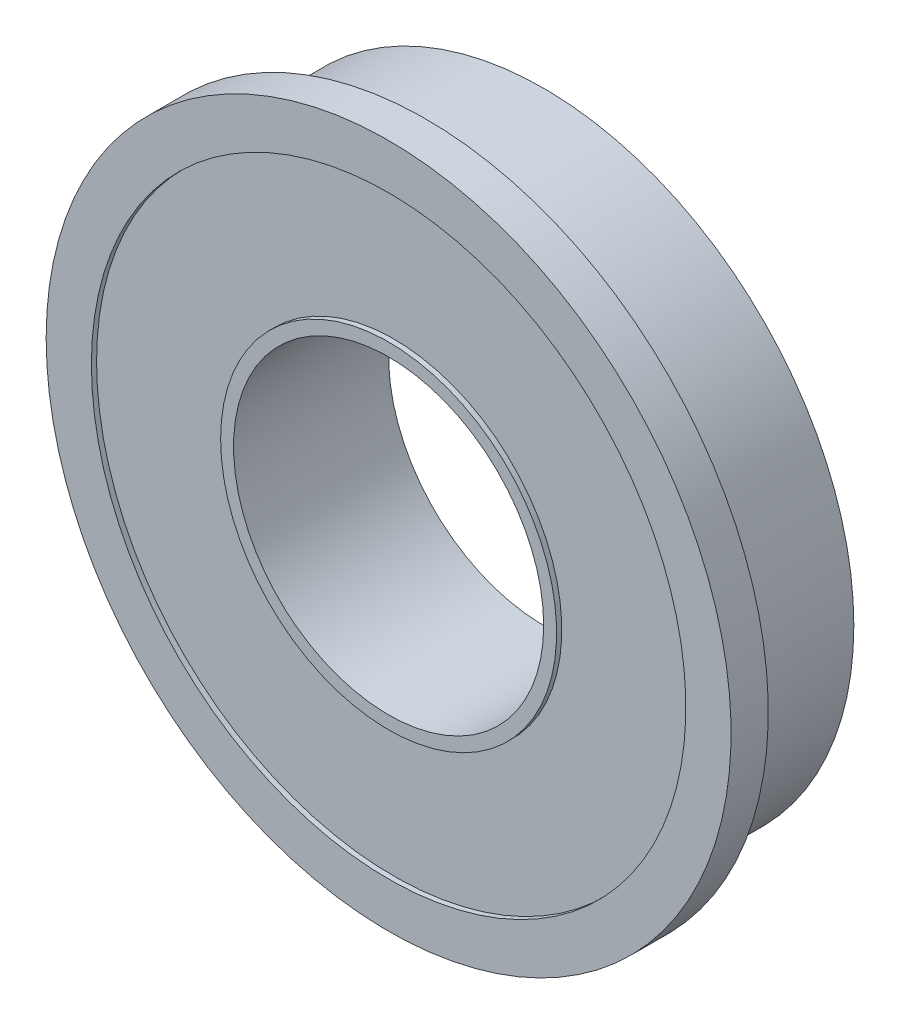
ISO-10303-21;
HEADER;
FILE_DESCRIPTION(('STEP AP214'),'2;1');
FILE_NAME('part.step','',(''),(''),'','','');
FILE_SCHEMA(('AUTOMOTIVE_DESIGN { 1 0 10303 214 1 1 1 1 }'));
ENDSEC;
DATA;
#1=APPLICATION_CONTEXT('core data for automotive mechanical design processes');
#2=APPLICATION_PROTOCOL_DEFINITION('international standard','automotive_design',2000,#1);
#3=PRODUCT_CONTEXT('',#1,'mechanical');
#4=PRODUCT('Part','Part','',(#3));
#5=PRODUCT_RELATED_PRODUCT_CATEGORY('part','',(#4));
#6=PRODUCT_DEFINITION_FORMATION('','',#4);
#7=PRODUCT_DEFINITION_CONTEXT('part definition',#1,'design');
#8=PRODUCT_DEFINITION('design','',#6,#7);
#9=PRODUCT_DEFINITION_SHAPE('','',#8);
#10=(LENGTH_UNIT() NAMED_UNIT(*) SI_UNIT(.MILLI.,.METRE.));
#11=(NAMED_UNIT(*) PLANE_ANGLE_UNIT() SI_UNIT($,.RADIAN.));
#12=(NAMED_UNIT(*) SI_UNIT($,.STERADIAN.) SOLID_ANGLE_UNIT());
#13=UNCERTAINTY_MEASURE_WITH_UNIT(LENGTH_MEASURE(1.E-05),#10,'distance_accuracy_value','');
#14=(GEOMETRIC_REPRESENTATION_CONTEXT(3) GLOBAL_UNCERTAINTY_ASSIGNED_CONTEXT((#13)) GLOBAL_UNIT_ASSIGNED_CONTEXT((#10,
#11,#12)) REPRESENTATION_CONTEXT('',''));
#15=CARTESIAN_POINT('',(0.,0.,0.));
#16=DIRECTION('',(0.,0.,1.));
#17=DIRECTION('',(1.,0.,0.));
#18=AXIS2_PLACEMENT_3D('',#15,#16,#17);
#19=CARTESIAN_POINT('',(0.,0.,1.44));
#20=DIRECTION('',(0.,0.,1.));
#21=DIRECTION('',(1.,0.,0.));
#22=AXIS2_PLACEMENT_3D('',#19,#20,#21);
#23=PLANE('',#22);
#24=CARTESIAN_POINT('',(0.,0.,1.44));
#25=DIRECTION('',(0.,0.,1.));
#26=DIRECTION('',(1.,0.,0.));
#27=AXIS2_PLACEMENT_3D('',#24,#25,#26);
#28=CIRCLE('',#27,6.);
#29=CARTESIAN_POINT('',(6.,0.,1.44));
#30=VERTEX_POINT('',#29);
#31=EDGE_CURVE('E56',#30,#30,#28,.T.);
#32=ORIENTED_EDGE('',*,*,#31,.F.);
#33=EDGE_LOOP('',(#32));
#34=FACE_BOUND('',#33,.T.);
#35=CARTESIAN_POINT('',(0.,0.,1.44));
#36=DIRECTION('',(0.,0.,-1.));
#37=DIRECTION('',(-1.,0.,0.));
#38=AXIS2_PLACEMENT_3D('',#35,#36,#37);
#39=CIRCLE('',#38,6.5);
#40=CARTESIAN_POINT('',(-6.5,0.,1.44));
#41=VERTEX_POINT('',#40);
#42=EDGE_CURVE('E80',#41,#41,#39,.T.);
#43=ORIENTED_EDGE('',*,*,#42,.F.);
#44=EDGE_LOOP('',(#43));
#45=FACE_BOUND('',#44,.T.);
#46=ADVANCED_FACE('F37',(#34,#45),#23,.T.);
#47=CARTESIAN_POINT('',(0.,0.,-4.56));
#48=DIRECTION('',(0.,0.,1.));
#49=DIRECTION('',(1.,0.,0.));
#50=AXIS2_PLACEMENT_3D('',#47,#48,#49);
#51=PLANE('',#50);
#52=CARTESIAN_POINT('',(0.,0.,-4.56));
#53=DIRECTION('',(0.,0.,1.));
#54=DIRECTION('',(1.,0.,0.));
#55=AXIS2_PLACEMENT_3D('',#52,#53,#54);
#56=CIRCLE('',#55,6.);
#57=CARTESIAN_POINT('',(6.,0.,-4.56));
#58=VERTEX_POINT('',#57);
#59=EDGE_CURVE('E55',#58,#58,#56,.T.);
#60=ORIENTED_EDGE('',*,*,#59,.T.);
#61=EDGE_LOOP('',(#60));
#62=FACE_BOUND('',#61,.T.);
#63=CARTESIAN_POINT('',(0.,0.,-4.56));
#64=DIRECTION('',(0.,0.,-1.));
#65=DIRECTION('',(-1.,0.,0.));
#66=AXIS2_PLACEMENT_3D('',#63,#64,#65);
#67=CIRCLE('',#66,6.5);
#68=CARTESIAN_POINT('',(-6.5,0.,-4.56));
#69=VERTEX_POINT('',#68);
#70=EDGE_CURVE('E68',#69,#69,#67,.T.);
#71=ORIENTED_EDGE('',*,*,#70,.T.);
#72=EDGE_LOOP('',(#71));
#73=FACE_BOUND('',#72,.T.);
#74=ADVANCED_FACE('F96',(#62,#73),#51,.F.);
#75=CARTESIAN_POINT('',(0.,0.,1.44));
#76=DIRECTION('',(0.,0.,-1.));
#77=DIRECTION('',(-1.,0.,0.));
#78=AXIS2_PLACEMENT_3D('',#75,#76,#77);
#79=CIRCLE('',#78,11.5);
#80=CARTESIAN_POINT('',(-11.5,0.,1.44));
#81=VERTEX_POINT('',#80);
#82=EDGE_CURVE('E74',#81,#81,#79,.T.);
#83=ORIENTED_EDGE('',*,*,#82,.T.);
#84=EDGE_LOOP('',(#83));
#85=FACE_BOUND('',#84,.T.);
#86=CARTESIAN_POINT('',(0.,0.,1.44));
#87=DIRECTION('',(0.,0.,1.));
#88=DIRECTION('',(1.,0.,0.));
#89=AXIS2_PLACEMENT_3D('',#86,#87,#88);
#90=CIRCLE('',#89,13.25);
#91=CARTESIAN_POINT('',(-13.25,0.,1.44));
#92=VERTEX_POINT('',#91);
#93=EDGE_CURVE('E10',#92,#92,#90,.T.);
#94=ORIENTED_EDGE('',*,*,#93,.T.);
#95=EDGE_LOOP('',(#94));
#96=FACE_BOUND('',#95,.T.);
#97=ADVANCED_FACE('F99',(#85,#96),#23,.T.);
#98=CARTESIAN_POINT('',(0.,0.,0.));
#99=DIRECTION('',(0.,0.,1.));
#100=DIRECTION('',(1.,0.,0.));
#101=AXIS2_PLACEMENT_3D('',#98,#99,#100);
#102=PLANE('',#101);
#103=CARTESIAN_POINT('',(0.,0.,0.));
#104=DIRECTION('',(0.,0.,1.));
#105=DIRECTION('',(1.,0.,0.));
#106=AXIS2_PLACEMENT_3D('',#103,#104,#105);
#107=CIRCLE('',#106,13.25);
#108=CARTESIAN_POINT('',(-13.25,0.,0.));
#109=VERTEX_POINT('',#108);
#110=EDGE_CURVE('E41',#109,#109,#107,.T.);
#111=ORIENTED_EDGE('',*,*,#110,.F.);
#112=EDGE_LOOP('',(#111));
#113=FACE_BOUND('',#112,.T.);
#114=CARTESIAN_POINT('',(0.,0.,0.));
#115=DIRECTION('',(0.,0.,1.));
#116=DIRECTION('',(1.,0.,0.));
#117=AXIS2_PLACEMENT_3D('',#114,#115,#116);
#118=CIRCLE('',#117,12.);
#119=CARTESIAN_POINT('',(12.,0.,0.));
#120=VERTEX_POINT('',#119);
#121=EDGE_CURVE('E48',#120,#120,#118,.T.);
#122=ORIENTED_EDGE('',*,*,#121,.T.);
#123=EDGE_LOOP('',(#122));
#124=FACE_BOUND('',#123,.T.);
#125=ADVANCED_FACE('F109',(#113,#124),#102,.F.);
#126=CARTESIAN_POINT('',(0.,0.,1.44));
#127=DIRECTION('',(0.,0.,-1.));
#128=DIRECTION('',(-1.,0.,0.));
#129=AXIS2_PLACEMENT_3D('',#126,#127,#128);
#130=CYLINDRICAL_SURFACE('',#129,13.25);
#131=CARTESIAN_POINT('',(-13.25,0.,1.44));
#132=CARTESIAN_POINT('',(-13.25,0.,1.425));
#133=CARTESIAN_POINT('',(-13.25,0.,1.41));
#134=CARTESIAN_POINT('',(-13.25,0.,1.38));
#135=CARTESIAN_POINT('',(-13.25,0.,1.365));
#136=CARTESIAN_POINT('',(-13.25,0.,1.335));
#137=CARTESIAN_POINT('',(-13.25,0.,1.32));
#138=CARTESIAN_POINT('',(-13.25,0.,1.29));
#139=CARTESIAN_POINT('',(-13.25,0.,1.275));
#140=CARTESIAN_POINT('',(-13.25,0.,1.245));
#141=CARTESIAN_POINT('',(-13.25,0.,1.23));
#142=CARTESIAN_POINT('',(-13.25,0.,1.2));
#143=CARTESIAN_POINT('',(-13.25,0.,1.185));
#144=CARTESIAN_POINT('',(-13.25,0.,1.155));
#145=CARTESIAN_POINT('',(-13.25,0.,1.14));
#146=CARTESIAN_POINT('',(-13.25,0.,1.11));
#147=CARTESIAN_POINT('',(-13.25,0.,1.095));
#148=CARTESIAN_POINT('',(-13.25,0.,1.065));
#149=CARTESIAN_POINT('',(-13.25,0.,1.05));
#150=CARTESIAN_POINT('',(-13.25,0.,1.02));
#151=CARTESIAN_POINT('',(-13.25,0.,1.005));
#152=CARTESIAN_POINT('',(-13.25,0.,0.975));
#153=CARTESIAN_POINT('',(-13.25,0.,0.96));
#154=CARTESIAN_POINT('',(-13.25,0.,0.93));
#155=CARTESIAN_POINT('',(-13.25,0.,0.915));
#156=CARTESIAN_POINT('',(-13.25,0.,0.885));
#157=CARTESIAN_POINT('',(-13.25,0.,0.87));
#158=CARTESIAN_POINT('',(-13.25,0.,0.84));
#159=CARTESIAN_POINT('',(-13.25,0.,0.825));
#160=CARTESIAN_POINT('',(-13.25,0.,0.795));
#161=CARTESIAN_POINT('',(-13.25,0.,0.78));
#162=CARTESIAN_POINT('',(-13.25,0.,0.75));
#163=CARTESIAN_POINT('',(-13.25,0.,0.735));
#164=CARTESIAN_POINT('',(-13.25,0.,0.705));
#165=CARTESIAN_POINT('',(-13.25,0.,0.69));
#166=CARTESIAN_POINT('',(-13.25,0.,0.66));
#167=CARTESIAN_POINT('',(-13.25,0.,0.645));
#168=CARTESIAN_POINT('',(-13.25,0.,0.615));
#169=CARTESIAN_POINT('',(-13.25,0.,0.6));
#170=CARTESIAN_POINT('',(-13.25,0.,0.57));
#171=CARTESIAN_POINT('',(-13.25,0.,0.555));
#172=CARTESIAN_POINT('',(-13.25,0.,0.525));
#173=CARTESIAN_POINT('',(-13.25,0.,0.51));
#174=CARTESIAN_POINT('',(-13.25,0.,0.48));
#175=CARTESIAN_POINT('',(-13.25,0.,0.465));
#176=CARTESIAN_POINT('',(-13.25,0.,0.435));
#177=CARTESIAN_POINT('',(-13.25,0.,0.42));
#178=CARTESIAN_POINT('',(-13.25,0.,0.39));
#179=CARTESIAN_POINT('',(-13.25,0.,0.375));
#180=CARTESIAN_POINT('',(-13.25,0.,0.345));
#181=CARTESIAN_POINT('',(-13.25,0.,0.33));
#182=CARTESIAN_POINT('',(-13.25,0.,0.3));
#183=CARTESIAN_POINT('',(-13.25,0.,0.285));
#184=CARTESIAN_POINT('',(-13.25,0.,0.255));
#185=CARTESIAN_POINT('',(-13.25,0.,0.24));
#186=CARTESIAN_POINT('',(-13.25,0.,0.21));
#187=CARTESIAN_POINT('',(-13.25,0.,0.195));
#188=CARTESIAN_POINT('',(-13.25,0.,0.165));
#189=CARTESIAN_POINT('',(-13.25,0.,0.15));
#190=CARTESIAN_POINT('',(-13.25,0.,0.12));
#191=CARTESIAN_POINT('',(-13.25,0.,0.105));
#192=CARTESIAN_POINT('',(-13.25,0.,0.0749999999999998));
#193=CARTESIAN_POINT('',(-13.25,0.,0.0599999999999997));
#194=CARTESIAN_POINT('',(-13.25,0.,0.0299999999999997));
#195=CARTESIAN_POINT('',(-13.25,0.,0.0149999999999998));
#196=CARTESIAN_POINT('',(-13.25,0.,0.));
#197=B_SPLINE_CURVE_WITH_KNOTS('',3,(#131,#132,#133,#134,#135,#136,#137,#138,#139,#140,#141,
#142,#143,#144,#145,#146,#147,#148,#149,#150,#151,#152,#153,#154,#155,#156,#157,#158,#159,#160,
#161,#162,#163,#164,#165,#166,#167,#168,#169,#170,#171,#172,#173,#174,#175,#176,#177,#178,#179,
#180,#181,#182,#183,#184,#185,#186,#187,#188,#189,#190,#191,#192,#193,#194,#195,#196),
.UNSPECIFIED.,.F.,.F.,(4,2,2,2,2,2,2,2,2,2,2,2,2,2,2,2,2,2,2,2,2,2,2,2,2,2,2,2,2,2,2,2,4),(0.,
0.0449999999999999,0.0899999999999998,0.135,0.18,0.225,0.27,0.315,0.36,0.405,0.45,0.495,0.54,
0.585,0.63,0.675,0.72,0.765,0.81,0.855,0.9,0.945,0.99,1.035,1.08,1.125,1.17,1.215,1.26,1.305,
1.35,1.395,1.44),.UNSPECIFIED.);
#198=EDGE_CURVE('BSEAM39',#92,#109,#197,.T.);
#199=ORIENTED_EDGE('',*,*,#93,.F.);
#200=ORIENTED_EDGE('',*,*,#110,.T.);
#201=ORIENTED_EDGE('',*,*,#198,.T.);
#202=ORIENTED_EDGE('',*,*,#198,.F.);
#203=EDGE_LOOP('',(#199,#201,#200,#202));
#204=FACE_BOUND('',#203,.T.);
#205=ADVANCED_FACE('F39',(#204),#130,.T.);
#206=CARTESIAN_POINT('',(0.,0.,-4.56));
#207=DIRECTION('',(0.,0.,1.));
#208=DIRECTION('',(1.,0.,0.));
#209=AXIS2_PLACEMENT_3D('',#206,#207,#208);
#210=CYLINDRICAL_SURFACE('',#209,12.);
#211=CARTESIAN_POINT('',(0.,0.,-4.56));
#212=DIRECTION('',(0.,0.,1.));
#213=DIRECTION('',(1.,0.,0.));
#214=AXIS2_PLACEMENT_3D('',#211,#212,#213);
#215=CIRCLE('',#214,12.);
#216=CARTESIAN_POINT('',(12.,0.,-4.56));
#217=VERTEX_POINT('',#216);
#218=EDGE_CURVE('E52',#217,#217,#215,.T.);
#219=ORIENTED_EDGE('',*,*,#218,.T.);
#220=EDGE_LOOP('',(#219));
#221=FACE_BOUND('',#220,.T.);
#222=ORIENTED_EDGE('',*,*,#121,.F.);
#223=EDGE_LOOP('',(#222));
#224=FACE_BOUND('',#223,.T.);
#225=ADVANCED_FACE('F142',(#221,#224),#210,.T.);
#226=CARTESIAN_POINT('',(0.,0.,-4.56));
#227=DIRECTION('',(0.,0.,-1.));
#228=DIRECTION('',(-1.,0.,0.));
#229=AXIS2_PLACEMENT_3D('',#226,#227,#228);
#230=CIRCLE('',#229,11.5);
#231=CARTESIAN_POINT('',(-11.5,0.,-4.56));
#232=VERTEX_POINT('',#231);
#233=EDGE_CURVE('E62',#232,#232,#230,.T.);
#234=ORIENTED_EDGE('',*,*,#233,.F.);
#235=EDGE_LOOP('',(#234));
#236=FACE_BOUND('',#235,.T.);
#237=ORIENTED_EDGE('',*,*,#218,.F.);
#238=EDGE_LOOP('',(#237));
#239=FACE_BOUND('',#238,.T.);
#240=ADVANCED_FACE('F105',(#236,#239),#51,.F.);
#241=CARTESIAN_POINT('',(0.,0.,-4.56));
#242=DIRECTION('',(0.,0.,1.));
#243=DIRECTION('',(1.,0.,0.));
#244=AXIS2_PLACEMENT_3D('',#241,#242,#243);
#245=CYLINDRICAL_SURFACE('',#244,6.);
#246=ORIENTED_EDGE('',*,*,#59,.F.);
#247=EDGE_LOOP('',(#246));
#248=FACE_BOUND('',#247,.T.);
#249=ORIENTED_EDGE('',*,*,#31,.T.);
#250=EDGE_LOOP('',(#249));
#251=FACE_BOUND('',#250,.T.);
#252=ADVANCED_FACE('F137',(#248,#251),#245,.F.);
#253=CARTESIAN_POINT('',(0.,0.,-4.36));
#254=DIRECTION('',(0.,0.,-1.));
#255=DIRECTION('',(-1.,0.,0.));
#256=AXIS2_PLACEMENT_3D('',#253,#254,#255);
#257=CYLINDRICAL_SURFACE('',#256,11.5);
#258=CARTESIAN_POINT('',(0.,0.,-4.36));
#259=DIRECTION('',(0.,0.,-1.));
#260=DIRECTION('',(-1.,0.,0.));
#261=AXIS2_PLACEMENT_3D('',#258,#259,#260);
#262=CIRCLE('',#261,11.5);
#263=CARTESIAN_POINT('',(-11.5,0.,-4.36));
#264=VERTEX_POINT('',#263);
#265=EDGE_CURVE('E59',#264,#264,#262,.T.);
#266=ORIENTED_EDGE('',*,*,#265,.F.);
#267=EDGE_LOOP('',(#266));
#268=FACE_BOUND('',#267,.T.);
#269=ORIENTED_EDGE('',*,*,#233,.T.);
#270=EDGE_LOOP('',(#269));
#271=FACE_BOUND('',#270,.T.);
#272=ADVANCED_FACE('F133',(#268,#271),#257,.F.);
#273=CARTESIAN_POINT('',(0.,0.,-4.36));
#274=DIRECTION('',(0.,0.,-1.));
#275=DIRECTION('',(-1.,0.,0.));
#276=AXIS2_PLACEMENT_3D('',#273,#274,#275);
#277=PLANE('',#276);
#278=CARTESIAN_POINT('',(0.,0.,-4.36));
#279=DIRECTION('',(0.,0.,-1.));
#280=DIRECTION('',(-1.,0.,0.));
#281=AXIS2_PLACEMENT_3D('',#278,#279,#280);
#282=CIRCLE('',#281,6.5);
#283=CARTESIAN_POINT('',(-6.5,0.,-4.36));
#284=VERTEX_POINT('',#283);
#285=EDGE_CURVE('E65',#284,#284,#282,.T.);
#286=ORIENTED_EDGE('',*,*,#285,.F.);
#287=EDGE_LOOP('',(#286));
#288=FACE_BOUND('',#287,.T.);
#289=ORIENTED_EDGE('',*,*,#265,.T.);
#290=EDGE_LOOP('',(#289));
#291=FACE_BOUND('',#290,.T.);
#292=ADVANCED_FACE('F129',(#288,#291),#277,.T.);
#293=CARTESIAN_POINT('',(0.,0.,-4.36));
#294=DIRECTION('',(0.,0.,-1.));
#295=DIRECTION('',(-1.,0.,0.));
#296=AXIS2_PLACEMENT_3D('',#293,#294,#295);
#297=CYLINDRICAL_SURFACE('',#296,6.5);
#298=ORIENTED_EDGE('',*,*,#285,.T.);
#299=EDGE_LOOP('',(#298));
#300=FACE_BOUND('',#299,.T.);
#301=ORIENTED_EDGE('',*,*,#70,.F.);
#302=EDGE_LOOP('',(#301));
#303=FACE_BOUND('',#302,.T.);
#304=ADVANCED_FACE('F123',(#300,#303),#297,.T.);
#305=CARTESIAN_POINT('',(0.,0.,1.24));
#306=DIRECTION('',(0.,0.,1.));
#307=DIRECTION('',(-1.,0.,0.));
#308=AXIS2_PLACEMENT_3D('',#305,#306,#307);
#309=PLANE('',#308);
#310=CARTESIAN_POINT('',(0.,0.,1.24));
#311=DIRECTION('',(0.,0.,-1.));
#312=DIRECTION('',(-1.,0.,0.));
#313=AXIS2_PLACEMENT_3D('',#310,#311,#312);
#314=CIRCLE('',#313,11.5);
#315=CARTESIAN_POINT('',(-11.5,0.,1.24));
#316=VERTEX_POINT('',#315);
#317=EDGE_CURVE('E71',#316,#316,#314,.T.);
#318=ORIENTED_EDGE('',*,*,#317,.F.);
#319=EDGE_LOOP('',(#318));
#320=FACE_BOUND('',#319,.T.);
#321=CARTESIAN_POINT('',(0.,0.,1.24));
#322=DIRECTION('',(0.,0.,-1.));
#323=DIRECTION('',(-1.,0.,0.));
#324=AXIS2_PLACEMENT_3D('',#321,#322,#323);
#325=CIRCLE('',#324,6.5);
#326=CARTESIAN_POINT('',(-6.5,0.,1.24));
#327=VERTEX_POINT('',#326);
#328=EDGE_CURVE('E77',#327,#327,#325,.T.);
#329=ORIENTED_EDGE('',*,*,#328,.T.);
#330=EDGE_LOOP('',(#329));
#331=FACE_BOUND('',#330,.T.);
#332=ADVANCED_FACE('F86',(#320,#331),#309,.T.);
#333=CARTESIAN_POINT('',(0.,0.,1.24));
#334=DIRECTION('',(0.,0.,1.));
#335=DIRECTION('',(1.,0.,0.));
#336=AXIS2_PLACEMENT_3D('',#333,#334,#335);
#337=CYLINDRICAL_SURFACE('',#336,11.5);
#338=ORIENTED_EDGE('',*,*,#317,.T.);
#339=EDGE_LOOP('',(#338));
#340=FACE_BOUND('',#339,.T.);
#341=ORIENTED_EDGE('',*,*,#82,.F.);
#342=EDGE_LOOP('',(#341));
#343=FACE_BOUND('',#342,.T.);
#344=ADVANCED_FACE('F91',(#340,#343),#337,.F.);
#345=CARTESIAN_POINT('',(0.,0.,1.24));
#346=DIRECTION('',(0.,0.,1.));
#347=DIRECTION('',(1.,0.,0.));
#348=AXIS2_PLACEMENT_3D('',#345,#346,#347);
#349=CYLINDRICAL_SURFACE('',#348,6.5);
#350=ORIENTED_EDGE('',*,*,#328,.F.);
#351=EDGE_LOOP('',(#350));
#352=FACE_BOUND('',#351,.T.);
#353=ORIENTED_EDGE('',*,*,#42,.T.);
#354=EDGE_LOOP('',(#353));
#355=FACE_BOUND('',#354,.T.);
#356=ADVANCED_FACE('F88',(#352,#355),#349,.T.);
#357=CLOSED_SHELL('',(#46,#74,#97,#125,#205,#225,#240,#252,#272,#292,#304,#332,#344,#356));
#358=MANIFOLD_SOLID_BREP('B2',#357);
#359=ADVANCED_BREP_SHAPE_REPRESENTATION('',(#18,#358),#14);
#360=SHAPE_DEFINITION_REPRESENTATION(#9,#359);
ENDSEC;
END-ISO-10303-21;
